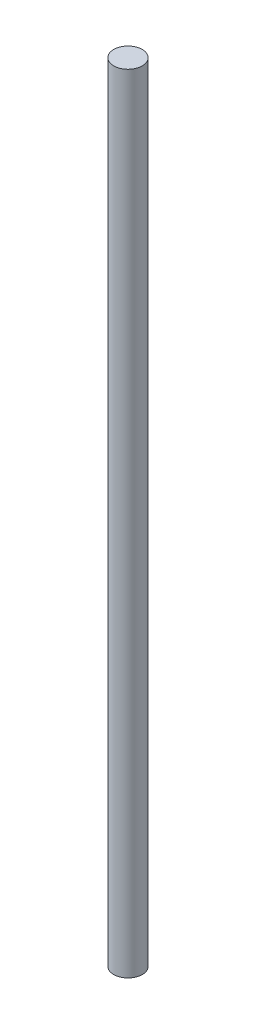
ISO-10303-21;
HEADER;
FILE_DESCRIPTION(('STEP AP214'),'2;1');
FILE_NAME('part.step','',(''),(''),'','','');
FILE_SCHEMA(('AUTOMOTIVE_DESIGN { 1 0 10303 214 1 1 1 1 }'));
ENDSEC;
DATA;
#1=APPLICATION_CONTEXT('core data for automotive mechanical design processes');
#2=APPLICATION_PROTOCOL_DEFINITION('international standard','automotive_design',2000,#1);
#3=PRODUCT_CONTEXT('',#1,'mechanical');
#4=PRODUCT('Part','Part','',(#3));
#5=PRODUCT_RELATED_PRODUCT_CATEGORY('part','',(#4));
#6=PRODUCT_DEFINITION_FORMATION('','',#4);
#7=PRODUCT_DEFINITION_CONTEXT('part definition',#1,'design');
#8=PRODUCT_DEFINITION('design','',#6,#7);
#9=PRODUCT_DEFINITION_SHAPE('','',#8);
#10=(LENGTH_UNIT() NAMED_UNIT(*) SI_UNIT(.MILLI.,.METRE.));
#11=(NAMED_UNIT(*) PLANE_ANGLE_UNIT() SI_UNIT($,.RADIAN.));
#12=(NAMED_UNIT(*) SI_UNIT($,.STERADIAN.) SOLID_ANGLE_UNIT());
#13=UNCERTAINTY_MEASURE_WITH_UNIT(LENGTH_MEASURE(1.E-05),#10,'distance_accuracy_value','');
#14=(GEOMETRIC_REPRESENTATION_CONTEXT(3) GLOBAL_UNCERTAINTY_ASSIGNED_CONTEXT((#13)) GLOBAL_UNIT_ASSIGNED_CONTEXT((#10,
#11,#12)) REPRESENTATION_CONTEXT('',''));
#15=CARTESIAN_POINT('',(0.,0.,0.));
#16=DIRECTION('',(0.,0.,1.));
#17=DIRECTION('',(1.,0.,0.));
#18=AXIS2_PLACEMENT_3D('',#15,#16,#17);
#19=CARTESIAN_POINT('',(0.,138.,0.));
#20=DIRECTION('',(0.,-1.,0.));
#21=DIRECTION('',(0.,0.,-1.));
#22=AXIS2_PLACEMENT_3D('',#19,#20,#21);
#23=CYLINDRICAL_SURFACE('',#22,2.5);
#24=CARTESIAN_POINT('',(0.,138.,0.));
#25=DIRECTION('',(0.,1.,0.));
#26=DIRECTION('',(0.,0.,1.));
#27=AXIS2_PLACEMENT_3D('',#24,#25,#26);
#28=CIRCLE('',#27,2.5);
#29=CARTESIAN_POINT('',(0.,138.,2.5));
#30=VERTEX_POINT('',#29);
#31=EDGE_CURVE('E10',#30,#30,#28,.T.);
#32=ORIENTED_EDGE('',*,*,#31,.F.);
#33=EDGE_LOOP('',(#32));
#34=FACE_BOUND('',#33,.T.);
#35=CARTESIAN_POINT('',(0.,0.,0.));
#36=DIRECTION('',(0.,1.,0.));
#37=DIRECTION('',(0.,0.,1.));
#38=AXIS2_PLACEMENT_3D('',#35,#36,#37);
#39=CIRCLE('',#38,2.5);
#40=CARTESIAN_POINT('',(0.,0.,2.5));
#41=VERTEX_POINT('',#40);
#42=EDGE_CURVE('E34',#41,#41,#39,.T.);
#43=ORIENTED_EDGE('',*,*,#42,.T.);
#44=EDGE_LOOP('',(#43));
#45=FACE_BOUND('',#44,.T.);
#46=ADVANCED_FACE('F31',(#34,#45),#23,.T.);
#47=CARTESIAN_POINT('',(0.,138.,0.));
#48=DIRECTION('',(0.,1.,0.));
#49=DIRECTION('',(0.,0.,1.));
#50=AXIS2_PLACEMENT_3D('',#47,#48,#49);
#51=PLANE('',#50);
#52=ORIENTED_EDGE('',*,*,#31,.T.);
#53=EDGE_LOOP('',(#52));
#54=FACE_BOUND('',#53,.T.);
#55=ADVANCED_FACE('F46',(#54),#51,.T.);
#56=CARTESIAN_POINT('',(0.,0.,0.));
#57=DIRECTION('',(0.,1.,0.));
#58=DIRECTION('',(0.,0.,1.));
#59=AXIS2_PLACEMENT_3D('',#56,#57,#58);
#60=PLANE('',#59);
#61=ORIENTED_EDGE('',*,*,#42,.F.);
#62=EDGE_LOOP('',(#61));
#63=FACE_BOUND('',#62,.T.);
#64=ADVANCED_FACE('F44',(#63),#60,.F.);
#65=CLOSED_SHELL('',(#46,#55,#64));
#66=MANIFOLD_SOLID_BREP('B2',#65);
#67=ADVANCED_BREP_SHAPE_REPRESENTATION('',(#18,#66),#14);
#68=SHAPE_DEFINITION_REPRESENTATION(#9,#67);
ENDSEC;
END-ISO-10303-21;
